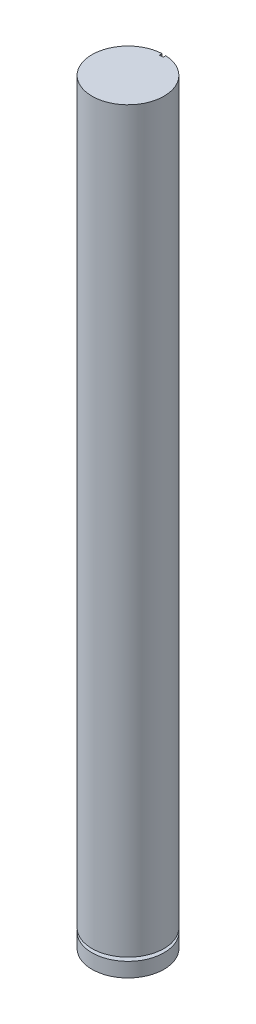
ISO-10303-21;
HEADER;
FILE_DESCRIPTION(('STEP AP214'),'2;1');
FILE_NAME('part.step','',(''),(''),'','','');
FILE_SCHEMA(('AUTOMOTIVE_DESIGN { 1 0 10303 214 1 1 1 1 }'));
ENDSEC;
DATA;
#1=APPLICATION_CONTEXT('core data for automotive mechanical design processes');
#2=APPLICATION_PROTOCOL_DEFINITION('international standard','automotive_design',2000,#1);
#3=PRODUCT_CONTEXT('',#1,'mechanical');
#4=PRODUCT('Part','Part','',(#3));
#5=PRODUCT_RELATED_PRODUCT_CATEGORY('part','',(#4));
#6=PRODUCT_DEFINITION_FORMATION('','',#4);
#7=PRODUCT_DEFINITION_CONTEXT('part definition',#1,'design');
#8=PRODUCT_DEFINITION('design','',#6,#7);
#9=PRODUCT_DEFINITION_SHAPE('','',#8);
#10=(LENGTH_UNIT() NAMED_UNIT(*) SI_UNIT(.MILLI.,.METRE.));
#11=(NAMED_UNIT(*) PLANE_ANGLE_UNIT() SI_UNIT($,.RADIAN.));
#12=(NAMED_UNIT(*) SI_UNIT($,.STERADIAN.) SOLID_ANGLE_UNIT());
#13=UNCERTAINTY_MEASURE_WITH_UNIT(LENGTH_MEASURE(1.E-05),#10,'distance_accuracy_value','');
#14=(GEOMETRIC_REPRESENTATION_CONTEXT(3) GLOBAL_UNCERTAINTY_ASSIGNED_CONTEXT((#13)) GLOBAL_UNIT_ASSIGNED_CONTEXT((#10,
#11,#12)) REPRESENTATION_CONTEXT('',''));
#15=CARTESIAN_POINT('',(0.,0.,0.));
#16=DIRECTION('',(0.,0.,1.));
#17=DIRECTION('',(1.,0.,0.));
#18=AXIS2_PLACEMENT_3D('',#15,#16,#17);
#19=CARTESIAN_POINT('',(0.,42.,0.));
#20=DIRECTION('',(0.,-1.,0.));
#21=DIRECTION('',(0.,0.,-1.));
#22=AXIS2_PLACEMENT_3D('',#19,#20,#21);
#23=CYLINDRICAL_SURFACE('',#22,2.);
#24=CARTESIAN_POINT('',(0.,0.8,0.));
#25=DIRECTION('',(0.,-1.,0.));
#26=DIRECTION('',(0.,0.,-1.));
#27=AXIS2_PLACEMENT_3D('',#24,#25,#26);
#28=CIRCLE('',#27,2.);
#29=CARTESIAN_POINT('',(0.,0.799999999999995,-2.));
#30=VERTEX_POINT('',#29);
#31=EDGE_CURVE('E111',#30,#30,#28,.T.);
#32=CARTESIAN_POINT('',(0.,0.,0.));
#33=DIRECTION('',(0.,1.,0.));
#34=DIRECTION('',(0.,0.,1.));
#35=AXIS2_PLACEMENT_3D('',#32,#33,#34);
#36=CIRCLE('',#35,2.);
#37=CARTESIAN_POINT('',(0.,0.,-2.));
#38=VERTEX_POINT('',#37);
#39=EDGE_CURVE('E114',#38,#38,#36,.T.);
#40=CARTESIAN_POINT('',(0.,0.799999999999995,-2.));
#41=CARTESIAN_POINT('',(0.,0.791666666666663,-2.));
#42=CARTESIAN_POINT('',(0.,0.78333333333333,-2.));
#43=CARTESIAN_POINT('',(0.,0.766666666666663,-2.));
#44=CARTESIAN_POINT('',(0.,0.758333333333328,-2.));
#45=CARTESIAN_POINT('',(0.,0.741666666666661,-2.));
#46=CARTESIAN_POINT('',(0.,0.733333333333329,-2.));
#47=CARTESIAN_POINT('',(0.,0.716666666666662,-2.));
#48=CARTESIAN_POINT('',(0.,0.708333333333327,-2.));
#49=CARTESIAN_POINT('',(0.,0.69166666666666,-2.));
#50=CARTESIAN_POINT('',(0.,0.683333333333327,-2.));
#51=CARTESIAN_POINT('',(0.,0.666666666666663,-2.));
#52=CARTESIAN_POINT('',(0.,0.65833333333333,-2.));
#53=CARTESIAN_POINT('',(0.,0.641666666666663,-2.));
#54=CARTESIAN_POINT('',(0.,0.633333333333328,-2.));
#55=CARTESIAN_POINT('',(0.,0.616666666666661,-2.));
#56=CARTESIAN_POINT('',(0.,0.608333333333329,-2.));
#57=CARTESIAN_POINT('',(0.,0.591666666666664,-2.));
#58=CARTESIAN_POINT('',(0.,0.583333333333331,-2.));
#59=CARTESIAN_POINT('',(0.,0.566666666666664,-2.));
#60=CARTESIAN_POINT('',(0.,0.55833333333333,-2.));
#61=CARTESIAN_POINT('',(0.,0.541666666666663,-2.));
#62=CARTESIAN_POINT('',(0.,0.53333333333333,-2.));
#63=CARTESIAN_POINT('',(0.,0.516666666666665,-2.));
#64=CARTESIAN_POINT('',(0.,0.508333333333333,-2.));
#65=CARTESIAN_POINT('',(0.,0.491666666666666,-2.));
#66=CARTESIAN_POINT('',(0.,0.483333333333331,-2.));
#67=CARTESIAN_POINT('',(0.,0.466666666666664,-2.));
#68=CARTESIAN_POINT('',(0.,0.458333333333331,-2.));
#69=CARTESIAN_POINT('',(0.,0.441666666666664,-2.));
#70=CARTESIAN_POINT('',(0.,0.43333333333333,-2.));
#71=CARTESIAN_POINT('',(0.,0.416666666666662,-2.));
#72=CARTESIAN_POINT('',(0.,0.40833333333333,-2.));
#73=CARTESIAN_POINT('',(0.,0.391666666666665,-2.));
#74=CARTESIAN_POINT('',(0.,0.383333333333333,-2.));
#75=CARTESIAN_POINT('',(0.,0.366666666666666,-2.));
#76=CARTESIAN_POINT('',(0.,0.358333333333331,-2.));
#77=CARTESIAN_POINT('',(0.,0.341666666666664,-2.));
#78=CARTESIAN_POINT('',(0.,0.333333333333331,-2.));
#79=CARTESIAN_POINT('',(0.,0.316666666666664,-2.));
#80=CARTESIAN_POINT('',(0.,0.308333333333329,-2.));
#81=CARTESIAN_POINT('',(0.,0.291666666666662,-2.));
#82=CARTESIAN_POINT('',(0.,0.28333333333333,-2.));
#83=CARTESIAN_POINT('',(0.,0.266666666666665,-2.));
#84=CARTESIAN_POINT('',(0.,0.258333333333333,-2.));
#85=CARTESIAN_POINT('',(0.,0.241666666666666,-2.));
#86=CARTESIAN_POINT('',(0.,0.233333333333331,-2.));
#87=CARTESIAN_POINT('',(0.,0.216666666666664,-2.));
#88=CARTESIAN_POINT('',(0.,0.208333333333331,-2.));
#89=CARTESIAN_POINT('',(0.,0.191666666666666,-2.));
#90=CARTESIAN_POINT('',(0.,0.183333333333334,-2.));
#91=CARTESIAN_POINT('',(0.,0.166666666666667,-2.));
#92=CARTESIAN_POINT('',(0.,0.158333333333332,-2.));
#93=CARTESIAN_POINT('',(0.,0.141666666666665,-2.));
#94=CARTESIAN_POINT('',(0.,0.133333333333333,-2.));
#95=CARTESIAN_POINT('',(0.,0.116666666666668,-2.));
#96=CARTESIAN_POINT('',(0.,0.108333333333335,-2.));
#97=CARTESIAN_POINT('',(0.,0.0916666666666681,-2.));
#98=CARTESIAN_POINT('',(0.,0.0833333333333334,-2.));
#99=CARTESIAN_POINT('',(0.,0.0666666666666663,-2.));
#100=CARTESIAN_POINT('',(0.,0.0583333333333338,-2.));
#101=CARTESIAN_POINT('',(0.,0.0416666666666667,-2.));
#102=CARTESIAN_POINT('',(0.,0.033333333333332,-2.));
#103=CARTESIAN_POINT('',(0.,0.0166666666666648,-2.));
#104=CARTESIAN_POINT('',(0.,0.0083333333333324,-2.));
#105=CARTESIAN_POINT('',(0.,0.,-2.));
#106=B_SPLINE_CURVE_WITH_KNOTS('',3,(#40,#41,#42,#43,#44,#45,#46,#47,#48,#49,#50,#51,#52,#53,
#54,#55,#56,#57,#58,#59,#60,#61,#62,#63,#64,#65,#66,#67,#68,#69,#70,#71,#72,#73,#74,#75,#76,#77,
#78,#79,#80,#81,#82,#83,#84,#85,#86,#87,#88,#89,#90,#91,#92,#93,#94,#95,#96,#97,#98,#99,#100,
#101,#102,#103,#104,#105),.UNSPECIFIED.,.F.,.F.,(4,2,2,2,2,2,2,2,2,2,2,2,2,2,2,2,2,2,2,2,2,2,2,
2,2,2,2,2,2,2,2,2,4),(0.,0.0249999999999972,0.0500000000000014,0.0749999999999987,
0.100000000000003,0.125,0.149999999999997,0.175000000000002,0.199999999999999,0.224999999999996,
0.25,0.274999999999997,0.299999999999995,0.324999999999999,0.349999999999996,0.375,
0.399999999999998,0.424999999999995,0.449999999999999,0.474999999999996,0.5,0.524999999999998,
0.549999999999995,0.574999999999999,0.599999999999996,0.624999999999994,0.649999999999998,
0.674999999999995,0.699999999999992,0.724999999999997,0.749999999999994,0.774999999999998,
0.799999999999995),.UNSPECIFIED.);
#107=EDGE_CURVE('BSEAM35',#30,#38,#106,.T.);
#108=ORIENTED_EDGE('',*,*,#31,.T.);
#109=ORIENTED_EDGE('',*,*,#39,.T.);
#110=ORIENTED_EDGE('',*,*,#107,.T.);
#111=ORIENTED_EDGE('',*,*,#107,.F.);
#112=EDGE_LOOP('',(#108,#110,#109,#111));
#113=FACE_BOUND('',#112,.T.);
#114=ADVANCED_FACE('F35',(#113),#23,.T.);
#115=CARTESIAN_POINT('',(0.,0.,0.));
#116=DIRECTION('',(0.,1.,0.));
#117=DIRECTION('',(0.,0.,1.));
#118=AXIS2_PLACEMENT_3D('',#115,#116,#117);
#119=PLANE('',#118);
#120=ORIENTED_EDGE('',*,*,#39,.F.);
#121=EDGE_LOOP('',(#120));
#122=FACE_BOUND('',#121,.T.);
#123=ADVANCED_FACE('F137',(#122),#119,.F.);
#124=CARTESIAN_POINT('',(0.,0.8,-2.));
#125=DIRECTION('',(0.,-1.,0.));
#126=DIRECTION('',(0.,0.,-1.));
#127=AXIS2_PLACEMENT_3D('',#124,#125,#126);
#128=PLANE('',#127);
#129=ORIENTED_EDGE('',*,*,#31,.F.);
#130=EDGE_LOOP('',(#129));
#131=FACE_BOUND('',#130,.T.);
#132=CARTESIAN_POINT('',(0.,0.8,0.));
#133=DIRECTION('',(0.,-1.,0.));
#134=DIRECTION('',(0.,0.,-1.));
#135=AXIS2_PLACEMENT_3D('',#132,#133,#134);
#136=CIRCLE('',#135,1.5);
#137=CARTESIAN_POINT('',(0.,0.8,-1.5));
#138=VERTEX_POINT('',#137);
#139=EDGE_CURVE('E108',#138,#138,#136,.T.);
#140=ORIENTED_EDGE('',*,*,#139,.T.);
#141=EDGE_LOOP('',(#140));
#142=FACE_BOUND('',#141,.T.);
#143=ADVANCED_FACE('F142',(#131,#142),#128,.F.);
#144=CARTESIAN_POINT('',(0.,0.,0.));
#145=DIRECTION('',(0.,-1.,0.));
#146=DIRECTION('',(0.,0.,-1.));
#147=AXIS2_PLACEMENT_3D('',#144,#145,#146);
#148=CYLINDRICAL_SURFACE('',#147,1.5);
#149=ORIENTED_EDGE('',*,*,#139,.F.);
#150=EDGE_LOOP('',(#149));
#151=FACE_BOUND('',#150,.T.);
#152=CARTESIAN_POINT('',(0.,1.,0.));
#153=DIRECTION('',(0.,-1.,0.));
#154=DIRECTION('',(0.,0.,-1.));
#155=AXIS2_PLACEMENT_3D('',#152,#153,#154);
#156=CIRCLE('',#155,1.5);
#157=CARTESIAN_POINT('',(0.,1.,-1.5));
#158=VERTEX_POINT('',#157);
#159=EDGE_CURVE('E105',#158,#158,#156,.T.);
#160=ORIENTED_EDGE('',*,*,#159,.T.);
#161=EDGE_LOOP('',(#160));
#162=FACE_BOUND('',#161,.T.);
#163=ADVANCED_FACE('F154',(#151,#162),#148,.T.);
#164=CARTESIAN_POINT('',(0.,1.,-2.));
#165=DIRECTION('',(0.,1.,0.));
#166=DIRECTION('',(0.,0.,1.));
#167=AXIS2_PLACEMENT_3D('',#164,#165,#166);
#168=PLANE('',#167);
#169=ORIENTED_EDGE('',*,*,#159,.F.);
#170=EDGE_LOOP('',(#169));
#171=FACE_BOUND('',#170,.T.);
#172=CARTESIAN_POINT('',(0.,1.,0.));
#173=DIRECTION('',(0.,-1.,0.));
#174=DIRECTION('',(0.,0.,-1.));
#175=AXIS2_PLACEMENT_3D('',#172,#173,#174);
#176=CIRCLE('',#175,2.);
#177=CARTESIAN_POINT('',(0.,1.,-2.));
#178=VERTEX_POINT('',#177);
#179=EDGE_CURVE('E101',#178,#178,#176,.T.);
#180=ORIENTED_EDGE('',*,*,#179,.T.);
#181=EDGE_LOOP('',(#180));
#182=FACE_BOUND('',#181,.T.);
#183=ADVANCED_FACE('F149',(#171,#182),#168,.F.);
#184=CARTESIAN_POINT('',(0.,42.,0.));
#185=DIRECTION('',(0.,1.,0.));
#186=DIRECTION('',(0.,0.,1.));
#187=AXIS2_PLACEMENT_3D('',#184,#185,#186);
#188=PLANE('',#187);
#189=DIRECTION('',(0.,0.,1.));
#190=VECTOR('',#189,1.);
#191=CARTESIAN_POINT('',(-0.1,42.,-2.));
#192=LINE('',#191,#190);
#193=CARTESIAN_POINT('',(-0.1,42.,-1.99749843554382));
#194=VERTEX_POINT('',#193);
#195=CARTESIAN_POINT('',(-0.1,42.,-1.85));
#196=VERTEX_POINT('',#195);
#197=EDGE_CURVE('E85',#194,#196,#192,.T.);
#198=ORIENTED_EDGE('',*,*,#197,.F.);
#199=CARTESIAN_POINT('',(0.,42.,0.));
#200=DIRECTION('',(0.,1.,0.));
#201=DIRECTION('',(0.,0.,1.));
#202=AXIS2_PLACEMENT_3D('',#199,#200,#201);
#203=CIRCLE('',#202,2.);
#204=CARTESIAN_POINT('',(0.1,42.,-1.99749843554382));
#205=VERTEX_POINT('',#204);
#206=EDGE_CURVE('E115',#194,#205,#203,.T.);
#207=ORIENTED_EDGE('',*,*,#206,.T.);
#208=DIRECTION('',(0.,0.,-1.));
#209=VECTOR('',#208,1.);
#210=CARTESIAN_POINT('',(0.1,42.,-2.));
#211=LINE('',#210,#209);
#212=CARTESIAN_POINT('',(0.1,42.,-1.85));
#213=VERTEX_POINT('',#212);
#214=EDGE_CURVE('E79',#213,#205,#211,.T.);
#215=ORIENTED_EDGE('',*,*,#214,.F.);
#216=DIRECTION('',(1.,0.,0.));
#217=VECTOR('',#216,1.);
#218=CARTESIAN_POINT('',(-0.1,42.,-1.85));
#219=LINE('',#218,#217);
#220=EDGE_CURVE('E98',#196,#213,#219,.T.);
#221=ORIENTED_EDGE('',*,*,#220,.F.);
#222=EDGE_LOOP('',(#198,#207,#215,#221));
#223=FACE_BOUND('',#222,.T.);
#224=ADVANCED_FACE('F125',(#223),#188,.T.);
#225=ORIENTED_EDGE('',*,*,#206,.F.);
#226=DIRECTION('',(0.,-1.,0.));
#227=VECTOR('',#226,1.);
#228=CARTESIAN_POINT('',(-0.1,42.,-1.99749843554382));
#229=LINE('',#228,#227);
#230=CARTESIAN_POINT('',(-0.1,39.,-1.99749843554382));
#231=VERTEX_POINT('',#230);
#232=EDGE_CURVE('E11',#194,#231,#229,.T.);
#233=ORIENTED_EDGE('',*,*,#232,.T.);
#234=CARTESIAN_POINT('',(0.,39.,0.));
#235=DIRECTION('',(0.,1.,0.));
#236=DIRECTION('',(0.,0.,1.));
#237=AXIS2_PLACEMENT_3D('',#234,#235,#236);
#238=CIRCLE('',#237,2.);
#239=CARTESIAN_POINT('',(0.1,39.,-1.99749843554382));
#240=VERTEX_POINT('',#239);
#241=EDGE_CURVE('E49',#240,#231,#238,.T.);
#242=ORIENTED_EDGE('',*,*,#241,.F.);
#243=DIRECTION('',(0.,-1.,0.));
#244=VECTOR('',#243,1.);
#245=CARTESIAN_POINT('',(0.1,42.,-1.99749843554382));
#246=LINE('',#245,#244);
#247=EDGE_CURVE('E43',#240,#205,#246,.F.);
#248=ORIENTED_EDGE('',*,*,#247,.T.);
#249=EDGE_LOOP('',(#225,#233,#242,#248));
#250=FACE_BOUND('',#249,.T.);
#251=ORIENTED_EDGE('',*,*,#179,.F.);
#252=EDGE_LOOP('',(#251));
#253=FACE_BOUND('',#252,.T.);
#254=ADVANCED_FACE('F37',(#250,#253),#23,.T.);
#255=CARTESIAN_POINT('',(-0.1,39.,-2.));
#256=DIRECTION('',(-1.,0.,0.));
#257=DIRECTION('',(0.,0.,1.));
#258=AXIS2_PLACEMENT_3D('',#255,#256,#257);
#259=PLANE('',#258);
#260=ORIENTED_EDGE('',*,*,#197,.T.);
#261=DIRECTION('',(0.,1.,0.));
#262=VECTOR('',#261,1.);
#263=CARTESIAN_POINT('',(-0.1,39.,-1.85));
#264=LINE('',#263,#262);
#265=CARTESIAN_POINT('',(-0.1,39.,-1.85));
#266=VERTEX_POINT('',#265);
#267=EDGE_CURVE('E82',#266,#196,#264,.T.);
#268=ORIENTED_EDGE('',*,*,#267,.F.);
#269=DIRECTION('',(0.,0.,1.));
#270=VECTOR('',#269,1.);
#271=CARTESIAN_POINT('',(-0.1,39.,-2.));
#272=LINE('',#271,#270);
#273=EDGE_CURVE('E73',#231,#266,#272,.T.);
#274=ORIENTED_EDGE('',*,*,#273,.F.);
#275=ORIENTED_EDGE('',*,*,#232,.F.);
#276=EDGE_LOOP('',(#260,#268,#274,#275));
#277=FACE_BOUND('',#276,.T.);
#278=ADVANCED_FACE('F83',(#277),#259,.F.);
#279=CARTESIAN_POINT('',(0.1,39.,-2.));
#280=DIRECTION('',(1.,0.,0.));
#281=DIRECTION('',(0.,0.,-1.));
#282=AXIS2_PLACEMENT_3D('',#279,#280,#281);
#283=PLANE('',#282);
#284=DIRECTION('',(0.,0.,-1.));
#285=VECTOR('',#284,1.);
#286=CARTESIAN_POINT('',(0.1,39.,-2.));
#287=LINE('',#286,#285);
#288=CARTESIAN_POINT('',(0.1,39.,-1.85));
#289=VERTEX_POINT('',#288);
#290=EDGE_CURVE('E90',#289,#240,#287,.T.);
#291=ORIENTED_EDGE('',*,*,#290,.F.);
#292=DIRECTION('',(0.,1.,0.));
#293=VECTOR('',#292,1.);
#294=CARTESIAN_POINT('',(0.1,39.,-1.85));
#295=LINE('',#294,#293);
#296=EDGE_CURVE('E89',#289,#213,#295,.T.);
#297=ORIENTED_EDGE('',*,*,#296,.T.);
#298=ORIENTED_EDGE('',*,*,#214,.T.);
#299=ORIENTED_EDGE('',*,*,#247,.F.);
#300=EDGE_LOOP('',(#291,#297,#298,#299));
#301=FACE_BOUND('',#300,.T.);
#302=ADVANCED_FACE('F126',(#301),#283,.F.);
#303=CARTESIAN_POINT('',(0.,39.,0.));
#304=DIRECTION('',(0.,1.,0.));
#305=DIRECTION('',(0.,0.,1.));
#306=AXIS2_PLACEMENT_3D('',#303,#304,#305);
#307=PLANE('',#306);
#308=ORIENTED_EDGE('',*,*,#290,.T.);
#309=ORIENTED_EDGE('',*,*,#241,.T.);
#310=ORIENTED_EDGE('',*,*,#273,.T.);
#311=DIRECTION('',(1.,0.,0.));
#312=VECTOR('',#311,1.);
#313=CARTESIAN_POINT('',(-0.1,39.,-1.85));
#314=LINE('',#313,#312);
#315=EDGE_CURVE('E77',#266,#289,#314,.T.);
#316=ORIENTED_EDGE('',*,*,#315,.T.);
#317=EDGE_LOOP('',(#308,#309,#310,#316));
#318=FACE_BOUND('',#317,.T.);
#319=ADVANCED_FACE('F75',(#318),#307,.T.);
#320=CARTESIAN_POINT('',(-0.1,39.,-1.85));
#321=DIRECTION('',(0.,0.,1.));
#322=DIRECTION('',(1.,0.,0.));
#323=AXIS2_PLACEMENT_3D('',#320,#321,#322);
#324=PLANE('',#323);
#325=ORIENTED_EDGE('',*,*,#220,.T.);
#326=ORIENTED_EDGE('',*,*,#296,.F.);
#327=ORIENTED_EDGE('',*,*,#315,.F.);
#328=ORIENTED_EDGE('',*,*,#267,.T.);
#329=EDGE_LOOP('',(#325,#326,#327,#328));
#330=FACE_BOUND('',#329,.T.);
#331=ADVANCED_FACE('F92',(#330),#324,.F.);
#332=CLOSED_SHELL('',(#114,#123,#143,#163,#183,#224,#254,#278,#302,#319,#331));
#333=MANIFOLD_SOLID_BREP('B2',#332);
#334=ADVANCED_BREP_SHAPE_REPRESENTATION('',(#18,#333),#14);
#335=SHAPE_DEFINITION_REPRESENTATION(#9,#334);
ENDSEC;
END-ISO-10303-21;
